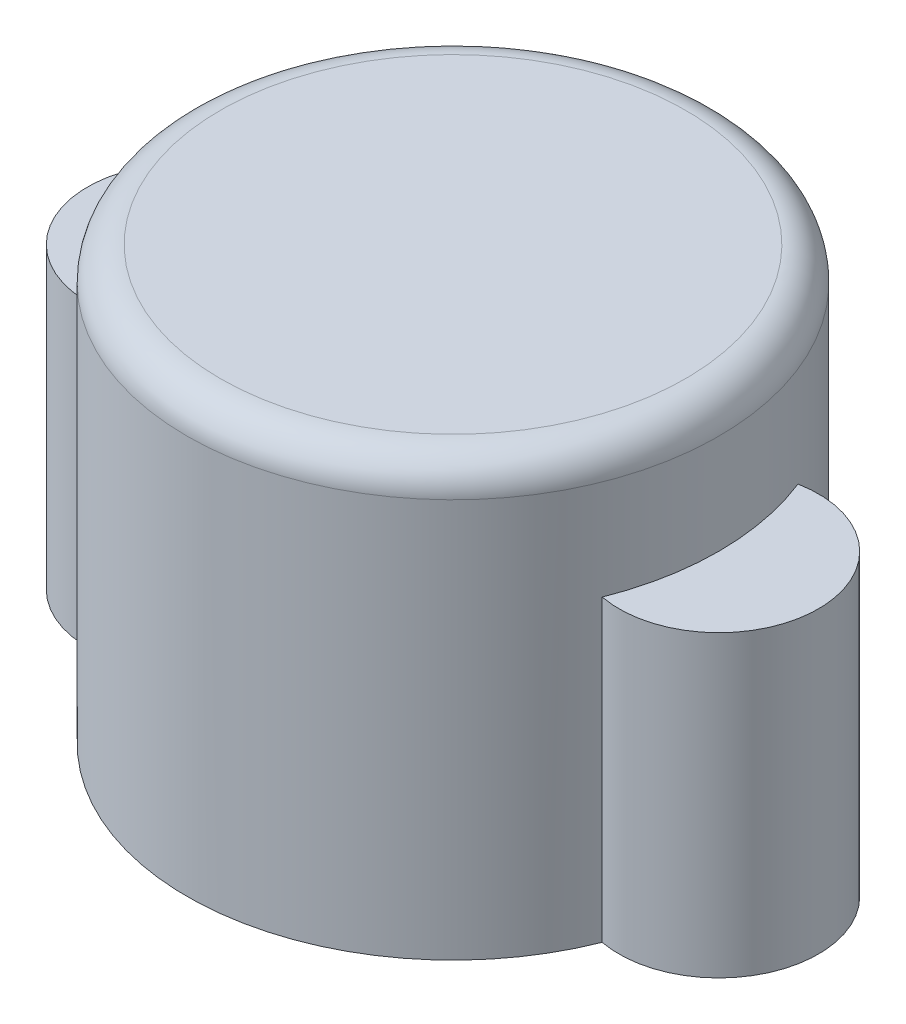
ISO-10303-21;
HEADER;
FILE_DESCRIPTION(('STEP AP214'),'2;1');
FILE_NAME('part.step','',(''),(''),'','','');
FILE_SCHEMA(('AUTOMOTIVE_DESIGN { 1 0 10303 214 1 1 1 1 }'));
ENDSEC;
DATA;
#1=APPLICATION_CONTEXT('core data for automotive mechanical design processes');
#2=APPLICATION_PROTOCOL_DEFINITION('international standard','automotive_design',2000,#1);
#3=PRODUCT_CONTEXT('',#1,'mechanical');
#4=PRODUCT('Part','Part','',(#3));
#5=PRODUCT_RELATED_PRODUCT_CATEGORY('part','',(#4));
#6=PRODUCT_DEFINITION_FORMATION('','',#4);
#7=PRODUCT_DEFINITION_CONTEXT('part definition',#1,'design');
#8=PRODUCT_DEFINITION('design','',#6,#7);
#9=PRODUCT_DEFINITION_SHAPE('','',#8);
#10=(LENGTH_UNIT() NAMED_UNIT(*) SI_UNIT(.MILLI.,.METRE.));
#11=(NAMED_UNIT(*) PLANE_ANGLE_UNIT() SI_UNIT($,.RADIAN.));
#12=(NAMED_UNIT(*) SI_UNIT($,.STERADIAN.) SOLID_ANGLE_UNIT());
#13=UNCERTAINTY_MEASURE_WITH_UNIT(LENGTH_MEASURE(1.E-05),#10,'distance_accuracy_value','');
#14=(GEOMETRIC_REPRESENTATION_CONTEXT(3) GLOBAL_UNCERTAINTY_ASSIGNED_CONTEXT((#13)) GLOBAL_UNIT_ASSIGNED_CONTEXT((#10,
#11,#12)) REPRESENTATION_CONTEXT('',''));
#15=CARTESIAN_POINT('',(0.,0.,0.));
#16=DIRECTION('',(0.,0.,1.));
#17=DIRECTION('',(1.,0.,0.));
#18=AXIS2_PLACEMENT_3D('',#15,#16,#17);
#19=CARTESIAN_POINT('',(0.,9.,0.));
#20=DIRECTION('',(0.,1.,0.));
#21=DIRECTION('',(0.,0.,1.));
#22=AXIS2_PLACEMENT_3D('',#19,#20,#21);
#23=PLANE('',#22);
#24=CARTESIAN_POINT('',(0.,9.,0.));
#25=DIRECTION('',(0.,1.,0.));
#26=DIRECTION('',(0.,0.,1.));
#27=AXIS2_PLACEMENT_3D('',#24,#25,#26);
#28=CIRCLE('',#27,8.);
#29=CARTESIAN_POINT('',(7.4375,9.,2.94679380853157));
#30=VERTEX_POINT('',#29);
#31=CARTESIAN_POINT('',(7.4375,9.,-2.94679380853157));
#32=VERTEX_POINT('',#31);
#33=EDGE_CURVE('E102',#30,#32,#28,.T.);
#34=ORIENTED_EDGE('',*,*,#33,.F.);
#35=CARTESIAN_POINT('',(8.,9.,0.));
#36=DIRECTION('',(0.,1.,0.));
#37=DIRECTION('',(0.,0.,1.));
#38=AXIS2_PLACEMENT_3D('',#35,#36,#37);
#39=CIRCLE('',#38,3.);
#40=EDGE_CURVE('E89',#30,#32,#39,.T.);
#41=ORIENTED_EDGE('',*,*,#40,.T.);
#42=EDGE_LOOP('',(#34,#41));
#43=FACE_BOUND('',#42,.T.);
#44=ADVANCED_FACE('F41',(#43),#23,.T.);
#45=CARTESIAN_POINT('',(-8.,9.,0.));
#46=DIRECTION('',(0.,-1.,0.));
#47=DIRECTION('',(0.,0.,-1.));
#48=AXIS2_PLACEMENT_3D('',#45,#46,#47);
#49=CYLINDRICAL_SURFACE('',#48,3.);
#50=CARTESIAN_POINT('',(-8.,0.,0.));
#51=DIRECTION('',(0.,1.,0.));
#52=DIRECTION('',(0.,0.,1.));
#53=AXIS2_PLACEMENT_3D('',#50,#51,#52);
#54=CIRCLE('',#53,3.);
#55=CARTESIAN_POINT('',(-7.4375,0.,2.94679380853157));
#56=VERTEX_POINT('',#55);
#57=CARTESIAN_POINT('',(-7.4375,0.,-2.94679380853157));
#58=VERTEX_POINT('',#57);
#59=EDGE_CURVE('E108',#56,#58,#54,.F.);
#60=ORIENTED_EDGE('',*,*,#59,.F.);
#61=DIRECTION('',(0.,-1.,0.));
#62=VECTOR('',#61,1.);
#63=CARTESIAN_POINT('',(-7.4375,9.,2.94679380853157));
#64=LINE('',#63,#62);
#65=CARTESIAN_POINT('',(-7.4375,9.,2.94679380853157));
#66=VERTEX_POINT('',#65);
#67=EDGE_CURVE('E86',#66,#56,#64,.T.);
#68=ORIENTED_EDGE('',*,*,#67,.F.);
#69=CARTESIAN_POINT('',(-8.,9.,0.));
#70=DIRECTION('',(0.,1.,0.));
#71=DIRECTION('',(0.,0.,1.));
#72=AXIS2_PLACEMENT_3D('',#69,#70,#71);
#73=CIRCLE('',#72,3.);
#74=CARTESIAN_POINT('',(-7.4375,9.,-2.94679380853157));
#75=VERTEX_POINT('',#74);
#76=EDGE_CURVE('E98',#66,#75,#73,.F.);
#77=ORIENTED_EDGE('',*,*,#76,.T.);
#78=DIRECTION('',(0.,-1.,0.));
#79=VECTOR('',#78,1.);
#80=CARTESIAN_POINT('',(-7.4375,9.,-2.94679380853157));
#81=LINE('',#80,#79);
#82=EDGE_CURVE('E83',#75,#58,#81,.T.);
#83=ORIENTED_EDGE('',*,*,#82,.T.);
#84=EDGE_LOOP('',(#60,#68,#77,#83));
#85=FACE_BOUND('',#84,.T.);
#86=ADVANCED_FACE('F133',(#85),#49,.T.);
#87=CARTESIAN_POINT('',(8.,9.,0.));
#88=DIRECTION('',(0.,-1.,0.));
#89=DIRECTION('',(0.,0.,-1.));
#90=AXIS2_PLACEMENT_3D('',#87,#88,#89);
#91=CYLINDRICAL_SURFACE('',#90,3.);
#92=CARTESIAN_POINT('',(8.,0.,0.));
#93=DIRECTION('',(0.,1.,0.));
#94=DIRECTION('',(0.,0.,1.));
#95=AXIS2_PLACEMENT_3D('',#92,#93,#94);
#96=CIRCLE('',#95,3.);
#97=CARTESIAN_POINT('',(7.4375,0.,2.94679380853157));
#98=VERTEX_POINT('',#97);
#99=CARTESIAN_POINT('',(7.4375,0.,-2.94679380853157));
#100=VERTEX_POINT('',#99);
#101=EDGE_CURVE('E77',#98,#100,#96,.T.);
#102=ORIENTED_EDGE('',*,*,#101,.T.);
#103=DIRECTION('',(0.,-1.,0.));
#104=VECTOR('',#103,1.);
#105=CARTESIAN_POINT('',(7.4375,9.,-2.94679380853157));
#106=LINE('',#105,#104);
#107=EDGE_CURVE('E93',#32,#100,#106,.T.);
#108=ORIENTED_EDGE('',*,*,#107,.F.);
#109=ORIENTED_EDGE('',*,*,#40,.F.);
#110=DIRECTION('',(0.,-1.,0.));
#111=VECTOR('',#110,1.);
#112=CARTESIAN_POINT('',(7.4375,9.,2.94679380853157));
#113=LINE('',#112,#111);
#114=EDGE_CURVE('E92',#30,#98,#113,.T.);
#115=ORIENTED_EDGE('',*,*,#114,.T.);
#116=EDGE_LOOP('',(#102,#108,#109,#115));
#117=FACE_BOUND('',#116,.T.);
#118=ADVANCED_FACE('F91',(#117),#91,.T.);
#119=CARTESIAN_POINT('',(0.,9.,0.));
#120=DIRECTION('',(0.,-1.,0.));
#121=DIRECTION('',(0.,0.,-1.));
#122=AXIS2_PLACEMENT_3D('',#119,#120,#121);
#123=CYLINDRICAL_SURFACE('',#122,8.);
#124=CARTESIAN_POINT('',(0.,12.,0.));
#125=DIRECTION('',(0.,1.,0.));
#126=DIRECTION('',(0.,0.,1.));
#127=AXIS2_PLACEMENT_3D('',#124,#125,#126);
#128=CIRCLE('',#127,8.);
#129=CARTESIAN_POINT('',(0.,12.,8.));
#130=VERTEX_POINT('',#129);
#131=EDGE_CURVE('E11',#130,#130,#128,.F.);
#132=ORIENTED_EDGE('',*,*,#131,.T.);
#133=EDGE_LOOP('',(#132));
#134=FACE_BOUND('',#133,.T.);
#135=CARTESIAN_POINT('',(0.,0.,0.));
#136=DIRECTION('',(0.,1.,0.));
#137=DIRECTION('',(0.,0.,1.));
#138=AXIS2_PLACEMENT_3D('',#135,#136,#137);
#139=CIRCLE('',#138,8.);
#140=EDGE_CURVE('E126',#100,#58,#139,.T.);
#141=ORIENTED_EDGE('',*,*,#140,.T.);
#142=ORIENTED_EDGE('',*,*,#82,.F.);
#143=EDGE_CURVE('E58',#75,#66,#28,.T.);
#144=ORIENTED_EDGE('',*,*,#143,.T.);
#145=ORIENTED_EDGE('',*,*,#67,.T.);
#146=EDGE_CURVE('E104',#56,#98,#139,.T.);
#147=ORIENTED_EDGE('',*,*,#146,.T.);
#148=ORIENTED_EDGE('',*,*,#114,.F.);
#149=ORIENTED_EDGE('',*,*,#33,.T.);
#150=ORIENTED_EDGE('',*,*,#107,.T.);
#151=EDGE_LOOP('',(#141,#142,#144,#145,#147,#148,#149,#150));
#152=FACE_BOUND('',#151,.T.);
#153=ADVANCED_FACE('F101',(#134,#152),#123,.T.);
#154=ORIENTED_EDGE('',*,*,#143,.F.);
#155=ORIENTED_EDGE('',*,*,#76,.F.);
#156=EDGE_LOOP('',(#154,#155));
#157=FACE_BOUND('',#156,.T.);
#158=ADVANCED_FACE('F141',(#157),#23,.T.);
#159=CARTESIAN_POINT('',(0.,0.,0.));
#160=DIRECTION('',(0.,1.,0.));
#161=DIRECTION('',(0.,0.,1.));
#162=AXIS2_PLACEMENT_3D('',#159,#160,#161);
#163=PLANE('',#162);
#164=ORIENTED_EDGE('',*,*,#59,.T.);
#165=ORIENTED_EDGE('',*,*,#140,.F.);
#166=ORIENTED_EDGE('',*,*,#101,.F.);
#167=ORIENTED_EDGE('',*,*,#146,.F.);
#168=EDGE_LOOP('',(#164,#165,#166,#167));
#169=FACE_BOUND('',#168,.T.);
#170=ADVANCED_FACE('F132',(#169),#163,.F.);
#171=CARTESIAN_POINT('',(0.,13.,0.));
#172=DIRECTION('',(0.,1.,0.));
#173=DIRECTION('',(0.,0.,1.));
#174=AXIS2_PLACEMENT_3D('',#171,#172,#173);
#175=PLANE('',#174);
#176=CARTESIAN_POINT('',(0.,13.,0.));
#177=DIRECTION('',(0.,1.,0.));
#178=DIRECTION('',(0.,0.,1.));
#179=AXIS2_PLACEMENT_3D('',#176,#177,#178);
#180=CIRCLE('',#179,7.);
#181=CARTESIAN_POINT('',(0.,13.,7.));
#182=VERTEX_POINT('',#181);
#183=EDGE_CURVE('E51',#182,#182,#180,.T.);
#184=ORIENTED_EDGE('',*,*,#183,.T.);
#185=EDGE_LOOP('',(#184));
#186=FACE_BOUND('',#185,.T.);
#187=ADVANCED_FACE('F147',(#186),#175,.T.);
#188=CARTESIAN_POINT('',(0.,12.,0.));
#189=DIRECTION('',(0.,1.,0.));
#190=DIRECTION('',(0.,0.,1.));
#191=AXIS2_PLACEMENT_3D('',#188,#189,#190);
#192=TOROIDAL_SURFACE('',#191,7.,1.);
#193=ORIENTED_EDGE('',*,*,#131,.F.);
#194=EDGE_LOOP('',(#193));
#195=FACE_BOUND('',#194,.T.);
#196=ORIENTED_EDGE('',*,*,#183,.F.);
#197=EDGE_LOOP('',(#196));
#198=FACE_BOUND('',#197,.T.);
#199=ADVANCED_FACE('F43',(#195,#198),#192,.T.);
#200=CLOSED_SHELL('',(#44,#86,#118,#153,#158,#170,#187,#199));
#201=MANIFOLD_SOLID_BREP('B2',#200);
#202=ADVANCED_BREP_SHAPE_REPRESENTATION('',(#18,#201),#14);
#203=SHAPE_DEFINITION_REPRESENTATION(#9,#202);
ENDSEC;
END-ISO-10303-21;
